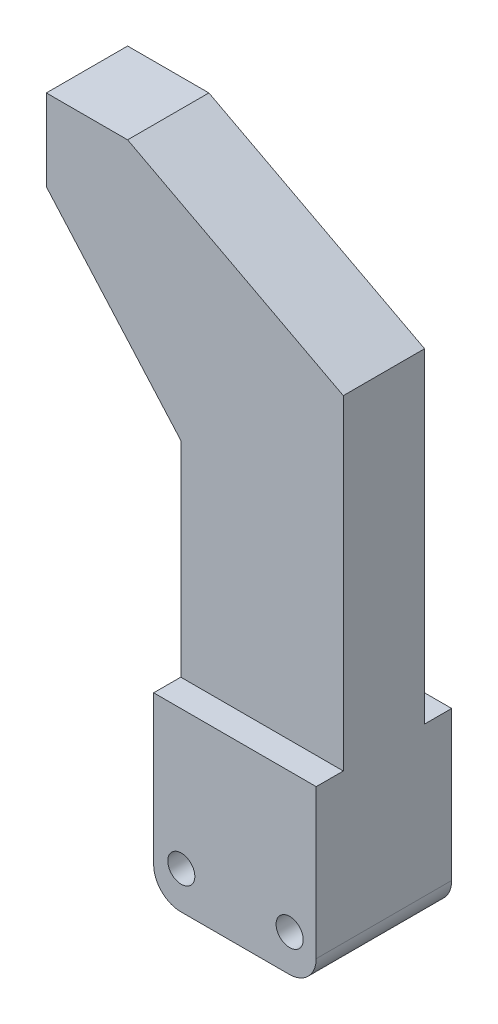
ISO-10303-21;
HEADER;
FILE_DESCRIPTION(('STEP AP214'),'2;1');
FILE_NAME('part.step','',(''),(''),'','','');
FILE_SCHEMA(('AUTOMOTIVE_DESIGN { 1 0 10303 214 1 1 1 1 }'));
ENDSEC;
DATA;
#1=APPLICATION_CONTEXT('core data for automotive mechanical design processes');
#2=APPLICATION_PROTOCOL_DEFINITION('international standard','automotive_design',2000,#1);
#3=PRODUCT_CONTEXT('',#1,'mechanical');
#4=PRODUCT('Part','Part','',(#3));
#5=PRODUCT_RELATED_PRODUCT_CATEGORY('part','',(#4));
#6=PRODUCT_DEFINITION_FORMATION('','',#4);
#7=PRODUCT_DEFINITION_CONTEXT('part definition',#1,'design');
#8=PRODUCT_DEFINITION('design','',#6,#7);
#9=PRODUCT_DEFINITION_SHAPE('','',#8);
#10=(LENGTH_UNIT() NAMED_UNIT(*) SI_UNIT(.MILLI.,.METRE.));
#11=(NAMED_UNIT(*) PLANE_ANGLE_UNIT() SI_UNIT($,.RADIAN.));
#12=(NAMED_UNIT(*) SI_UNIT($,.STERADIAN.) SOLID_ANGLE_UNIT());
#13=UNCERTAINTY_MEASURE_WITH_UNIT(LENGTH_MEASURE(1.E-05),#10,'distance_accuracy_value','');
#14=(GEOMETRIC_REPRESENTATION_CONTEXT(3) GLOBAL_UNCERTAINTY_ASSIGNED_CONTEXT((#13)) GLOBAL_UNIT_ASSIGNED_CONTEXT((#10,
#11,#12)) REPRESENTATION_CONTEXT('',''));
#15=CARTESIAN_POINT('',(0.,0.,0.));
#16=DIRECTION('',(0.,0.,1.));
#17=DIRECTION('',(1.,0.,0.));
#18=AXIS2_PLACEMENT_3D('',#15,#16,#17);
#19=CARTESIAN_POINT('',(0.,0.,9.));
#20=DIRECTION('',(-1.,0.,0.));
#21=DIRECTION('',(0.,-1.,0.));
#22=AXIS2_PLACEMENT_3D('',#19,#20,#21);
#23=PLANE('',#22);
#24=DIRECTION('',(0.,1.,0.));
#25=VECTOR('',#24,1.);
#26=CARTESIAN_POINT('',(0.,0.,15.));
#27=LINE('',#26,#25);
#28=CARTESIAN_POINT('',(0.,-33.,15.));
#29=VERTEX_POINT('',#28);
#30=CARTESIAN_POINT('',(0.,0.,15.));
#31=VERTEX_POINT('',#30);
#32=EDGE_CURVE('E133',#29,#31,#27,.T.);
#33=ORIENTED_EDGE('',*,*,#32,.F.);
#34=DIRECTION('',(0.,0.,-1.));
#35=VECTOR('',#34,1.);
#36=CARTESIAN_POINT('',(0.,-33.,9.));
#37=LINE('',#36,#35);
#38=CARTESIAN_POINT('',(0.,-33.,-15.));
#39=VERTEX_POINT('',#38);
#40=EDGE_CURVE('E11',#29,#39,#37,.T.);
#41=ORIENTED_EDGE('',*,*,#40,.T.);
#42=DIRECTION('',(0.,1.,0.));
#43=VECTOR('',#42,1.);
#44=CARTESIAN_POINT('',(0.,0.,-15.));
#45=LINE('',#44,#43);
#46=CARTESIAN_POINT('',(0.,0.,-15.));
#47=VERTEX_POINT('',#46);
#48=EDGE_CURVE('E166',#39,#47,#45,.T.);
#49=ORIENTED_EDGE('',*,*,#48,.T.);
#50=DIRECTION('',(0.,0.,-1.));
#51=VECTOR('',#50,1.);
#52=CARTESIAN_POINT('',(0.,0.,15.));
#53=LINE('',#52,#51);
#54=CARTESIAN_POINT('',(0.,0.,-9.));
#55=VERTEX_POINT('',#54);
#56=EDGE_CURVE('E150',#55,#47,#53,.T.);
#57=ORIENTED_EDGE('',*,*,#56,.F.);
#58=DIRECTION('',(0.,1.,0.));
#59=VECTOR('',#58,1.);
#60=CARTESIAN_POINT('',(0.,0.,-9.));
#61=LINE('',#60,#59);
#62=CARTESIAN_POINT('',(0.,72.,-9.));
#63=VERTEX_POINT('',#62);
#64=EDGE_CURVE('E189',#55,#63,#61,.T.);
#65=ORIENTED_EDGE('',*,*,#64,.T.);
#66=DIRECTION('',(0.,0.,-1.));
#67=VECTOR('',#66,1.);
#68=CARTESIAN_POINT('',(0.,72.,9.));
#69=LINE('',#68,#67);
#70=CARTESIAN_POINT('',(0.,72.,9.));
#71=VERTEX_POINT('',#70);
#72=EDGE_CURVE('E212',#71,#63,#69,.T.);
#73=ORIENTED_EDGE('',*,*,#72,.F.);
#74=DIRECTION('',(0.,1.,0.));
#75=VECTOR('',#74,1.);
#76=CARTESIAN_POINT('',(0.,0.,9.));
#77=LINE('',#76,#75);
#78=CARTESIAN_POINT('',(0.,0.,9.));
#79=VERTEX_POINT('',#78);
#80=EDGE_CURVE('E146',#79,#71,#77,.T.);
#81=ORIENTED_EDGE('',*,*,#80,.F.);
#82=EDGE_CURVE('E144',#31,#79,#53,.T.);
#83=ORIENTED_EDGE('',*,*,#82,.F.);
#84=EDGE_LOOP('',(#33,#41,#49,#57,#65,#73,#81,#83));
#85=FACE_BOUND('',#84,.T.);
#86=ADVANCED_FACE('F38',(#85),#23,.F.);
#87=CARTESIAN_POINT('',(0.,72.,9.));
#88=DIRECTION('',(-0.466293195068433,-0.884630237010284,0.));
#89=DIRECTION('',(0.884630237010285,-0.466293195068433,0.));
#90=AXIS2_PLACEMENT_3D('',#87,#88,#89);
#91=PLANE('',#90);
#92=DIRECTION('',(-0.884630237010284,0.466293195068433,0.));
#93=VECTOR('',#92,1.);
#94=CARTESIAN_POINT('',(0.,72.,-9.));
#95=LINE('',#94,#93);
#96=CARTESIAN_POINT('',(-47.7700327985554,97.1798325336954,-9.));
#97=VERTEX_POINT('',#96);
#98=EDGE_CURVE('E191',#63,#97,#95,.T.);
#99=ORIENTED_EDGE('',*,*,#98,.T.);
#100=DIRECTION('',(0.,0.,-1.));
#101=VECTOR('',#100,1.);
#102=CARTESIAN_POINT('',(-47.7700327985554,97.1798325336954,9.));
#103=LINE('',#102,#101);
#104=CARTESIAN_POINT('',(-47.7700327985554,97.1798325336954,9.));
#105=VERTEX_POINT('',#104);
#106=EDGE_CURVE('E209',#105,#97,#103,.T.);
#107=ORIENTED_EDGE('',*,*,#106,.F.);
#108=DIRECTION('',(-0.884630237010284,0.466293195068433,0.));
#109=VECTOR('',#108,1.);
#110=CARTESIAN_POINT('',(0.,72.,9.));
#111=LINE('',#110,#109);
#112=EDGE_CURVE('E176',#71,#105,#111,.T.);
#113=ORIENTED_EDGE('',*,*,#112,.F.);
#114=ORIENTED_EDGE('',*,*,#72,.T.);
#115=EDGE_LOOP('',(#99,#107,#113,#114));
#116=FACE_BOUND('',#115,.T.);
#117=ADVANCED_FACE('F254',(#116),#91,.F.);
#118=CARTESIAN_POINT('',(-47.7700327985554,97.1798325336954,9.));
#119=DIRECTION('',(0.,-1.,0.));
#120=DIRECTION('',(0.,0.,-1.));
#121=AXIS2_PLACEMENT_3D('',#118,#119,#120);
#122=PLANE('',#121);
#123=DIRECTION('',(-1.,0.,0.));
#124=VECTOR('',#123,1.);
#125=CARTESIAN_POINT('',(-47.7700327985554,97.1798325336954,-9.));
#126=LINE('',#125,#124);
#127=CARTESIAN_POINT('',(-65.7700327985554,97.1798325336954,-9.));
#128=VERTEX_POINT('',#127);
#129=EDGE_CURVE('E193',#97,#128,#126,.T.);
#130=ORIENTED_EDGE('',*,*,#129,.T.);
#131=DIRECTION('',(0.,0.,-1.));
#132=VECTOR('',#131,1.);
#133=CARTESIAN_POINT('',(-65.7700327985554,97.1798325336954,9.));
#134=LINE('',#133,#132);
#135=CARTESIAN_POINT('',(-65.7700327985554,97.1798325336954,9.));
#136=VERTEX_POINT('',#135);
#137=EDGE_CURVE('E206',#136,#128,#134,.T.);
#138=ORIENTED_EDGE('',*,*,#137,.F.);
#139=DIRECTION('',(-1.,0.,0.));
#140=VECTOR('',#139,1.);
#141=CARTESIAN_POINT('',(-47.7700327985554,97.1798325336954,9.));
#142=LINE('',#141,#140);
#143=EDGE_CURVE('E178',#105,#136,#142,.T.);
#144=ORIENTED_EDGE('',*,*,#143,.F.);
#145=ORIENTED_EDGE('',*,*,#106,.T.);
#146=EDGE_LOOP('',(#130,#138,#144,#145));
#147=FACE_BOUND('',#146,.T.);
#148=ADVANCED_FACE('F261',(#147),#122,.F.);
#149=CARTESIAN_POINT('',(-65.7700327985554,97.1798325336954,9.));
#150=DIRECTION('',(1.,0.,0.));
#151=DIRECTION('',(0.,0.,-1.));
#152=AXIS2_PLACEMENT_3D('',#149,#150,#151);
#153=PLANE('',#152);
#154=DIRECTION('',(0.,-1.,0.));
#155=VECTOR('',#154,1.);
#156=CARTESIAN_POINT('',(-65.7700327985554,97.1798325336954,-9.));
#157=LINE('',#156,#155);
#158=CARTESIAN_POINT('',(-65.7700327985554,79.1798325336954,-9.));
#159=VERTEX_POINT('',#158);
#160=EDGE_CURVE('E195',#128,#159,#157,.T.);
#161=ORIENTED_EDGE('',*,*,#160,.T.);
#162=DIRECTION('',(0.,0.,-1.));
#163=VECTOR('',#162,1.);
#164=CARTESIAN_POINT('',(-65.7700327985554,79.1798325336954,9.));
#165=LINE('',#164,#163);
#166=CARTESIAN_POINT('',(-65.7700327985554,79.1798325336954,9.));
#167=VERTEX_POINT('',#166);
#168=EDGE_CURVE('E203',#167,#159,#165,.T.);
#169=ORIENTED_EDGE('',*,*,#168,.F.);
#170=DIRECTION('',(0.,-1.,0.));
#171=VECTOR('',#170,1.);
#172=CARTESIAN_POINT('',(-65.7700327985554,97.1798325336954,9.));
#173=LINE('',#172,#171);
#174=EDGE_CURVE('E180',#136,#167,#173,.T.);
#175=ORIENTED_EDGE('',*,*,#174,.F.);
#176=ORIENTED_EDGE('',*,*,#137,.T.);
#177=EDGE_LOOP('',(#161,#169,#175,#176));
#178=FACE_BOUND('',#177,.T.);
#179=ADVANCED_FACE('F267',(#178),#153,.F.);
#180=CARTESIAN_POINT('',(-65.7700327985554,79.1798325336954,9.));
#181=DIRECTION('',(0.749895514424868,0.661556284412342,0.));
#182=DIRECTION('',(-0.661556284412342,0.749895514424868,0.));
#183=AXIS2_PLACEMENT_3D('',#180,#181,#182);
#184=PLANE('',#183);
#185=DIRECTION('',(0.661556284412342,-0.749895514424868,0.));
#186=VECTOR('',#185,1.);
#187=CARTESIAN_POINT('',(-65.7700327985554,79.1798325336954,-9.));
#188=LINE('',#187,#186);
#189=CARTESIAN_POINT('',(-36.,45.4345343845764,-9.));
#190=VERTEX_POINT('',#189);
#191=EDGE_CURVE('E197',#159,#190,#188,.T.);
#192=ORIENTED_EDGE('',*,*,#191,.T.);
#193=DIRECTION('',(0.,0.,-1.));
#194=VECTOR('',#193,1.);
#195=CARTESIAN_POINT('',(-36.,45.4345343845764,9.));
#196=LINE('',#195,#194);
#197=CARTESIAN_POINT('',(-36.,45.4345343845764,9.));
#198=VERTEX_POINT('',#197);
#199=EDGE_CURVE('E187',#198,#190,#196,.T.);
#200=ORIENTED_EDGE('',*,*,#199,.F.);
#201=DIRECTION('',(0.661556284412342,-0.749895514424868,0.));
#202=VECTOR('',#201,1.);
#203=CARTESIAN_POINT('',(-65.7700327985554,79.1798325336954,9.));
#204=LINE('',#203,#202);
#205=EDGE_CURVE('E182',#167,#198,#204,.T.);
#206=ORIENTED_EDGE('',*,*,#205,.F.);
#207=ORIENTED_EDGE('',*,*,#168,.T.);
#208=EDGE_LOOP('',(#192,#200,#206,#207));
#209=FACE_BOUND('',#208,.T.);
#210=ADVANCED_FACE('F271',(#209),#184,.F.);
#211=CARTESIAN_POINT('',(-36.,45.4345343845764,9.));
#212=DIRECTION('',(1.,0.,0.));
#213=DIRECTION('',(0.,1.,0.));
#214=AXIS2_PLACEMENT_3D('',#211,#212,#213);
#215=PLANE('',#214);
#216=DIRECTION('',(0.,-1.,0.));
#217=VECTOR('',#216,1.);
#218=CARTESIAN_POINT('',(-36.,0.,-15.));
#219=LINE('',#218,#217);
#220=CARTESIAN_POINT('',(-36.,0.,-15.));
#221=VERTEX_POINT('',#220);
#222=CARTESIAN_POINT('',(-36.,-33.,-15.));
#223=VERTEX_POINT('',#222);
#224=EDGE_CURVE('E160',#221,#223,#219,.T.);
#225=ORIENTED_EDGE('',*,*,#224,.T.);
#226=DIRECTION('',(0.,0.,-1.));
#227=VECTOR('',#226,1.);
#228=CARTESIAN_POINT('',(-36.,-33.,9.));
#229=LINE('',#228,#227);
#230=CARTESIAN_POINT('',(-36.,-33.,15.));
#231=VERTEX_POINT('',#230);
#232=EDGE_CURVE('E61',#223,#231,#229,.F.);
#233=ORIENTED_EDGE('',*,*,#232,.T.);
#234=DIRECTION('',(0.,-1.,0.));
#235=VECTOR('',#234,1.);
#236=CARTESIAN_POINT('',(-36.,0.,15.));
#237=LINE('',#236,#235);
#238=CARTESIAN_POINT('',(-36.,0.,15.));
#239=VERTEX_POINT('',#238);
#240=EDGE_CURVE('E170',#239,#231,#237,.T.);
#241=ORIENTED_EDGE('',*,*,#240,.F.);
#242=DIRECTION('',(0.,0.,-1.));
#243=VECTOR('',#242,1.);
#244=CARTESIAN_POINT('',(-36.,0.,15.));
#245=LINE('',#244,#243);
#246=CARTESIAN_POINT('',(-36.,0.,9.));
#247=VERTEX_POINT('',#246);
#248=EDGE_CURVE('E154',#239,#247,#245,.T.);
#249=ORIENTED_EDGE('',*,*,#248,.T.);
#250=DIRECTION('',(0.,-1.,0.));
#251=VECTOR('',#250,1.);
#252=CARTESIAN_POINT('',(-36.,45.4345343845764,9.));
#253=LINE('',#252,#251);
#254=EDGE_CURVE('E184',#198,#247,#253,.T.);
#255=ORIENTED_EDGE('',*,*,#254,.F.);
#256=ORIENTED_EDGE('',*,*,#199,.T.);
#257=DIRECTION('',(0.,-1.,0.));
#258=VECTOR('',#257,1.);
#259=CARTESIAN_POINT('',(-36.,45.4345343845764,-9.));
#260=LINE('',#259,#258);
#261=CARTESIAN_POINT('',(-36.,0.,-9.));
#262=VERTEX_POINT('',#261);
#263=EDGE_CURVE('E174',#190,#262,#260,.T.);
#264=ORIENTED_EDGE('',*,*,#263,.T.);
#265=EDGE_CURVE('E155',#262,#221,#245,.T.);
#266=ORIENTED_EDGE('',*,*,#265,.T.);
#267=EDGE_LOOP('',(#225,#233,#241,#249,#255,#256,#264,#266));
#268=FACE_BOUND('',#267,.T.);
#269=ADVANCED_FACE('F238',(#268),#215,.F.);
#270=CARTESIAN_POINT('',(0.,0.,9.));
#271=DIRECTION('',(0.,0.,1.));
#272=DIRECTION('',(1.,0.,0.));
#273=AXIS2_PLACEMENT_3D('',#270,#271,#272);
#274=PLANE('',#273);
#275=DIRECTION('',(1.,0.,0.));
#276=VECTOR('',#275,1.);
#277=CARTESIAN_POINT('',(-36.,0.,9.));
#278=LINE('',#277,#276);
#279=EDGE_CURVE('E172',#247,#79,#278,.T.);
#280=ORIENTED_EDGE('',*,*,#279,.T.);
#281=ORIENTED_EDGE('',*,*,#80,.T.);
#282=ORIENTED_EDGE('',*,*,#112,.T.);
#283=ORIENTED_EDGE('',*,*,#143,.T.);
#284=ORIENTED_EDGE('',*,*,#174,.T.);
#285=ORIENTED_EDGE('',*,*,#205,.T.);
#286=ORIENTED_EDGE('',*,*,#254,.T.);
#287=EDGE_LOOP('',(#280,#281,#282,#283,#284,#285,#286));
#288=FACE_BOUND('',#287,.T.);
#289=ADVANCED_FACE('F277',(#288),#274,.T.);
#290=CARTESIAN_POINT('',(0.,0.,-9.));
#291=DIRECTION('',(0.,0.,1.));
#292=DIRECTION('',(1.,0.,0.));
#293=AXIS2_PLACEMENT_3D('',#290,#291,#292);
#294=PLANE('',#293);
#295=DIRECTION('',(1.,0.,0.));
#296=VECTOR('',#295,1.);
#297=CARTESIAN_POINT('',(-36.,0.,-9.));
#298=LINE('',#297,#296);
#299=EDGE_CURVE('E149',#262,#55,#298,.T.);
#300=ORIENTED_EDGE('',*,*,#299,.F.);
#301=ORIENTED_EDGE('',*,*,#263,.F.);
#302=ORIENTED_EDGE('',*,*,#191,.F.);
#303=ORIENTED_EDGE('',*,*,#160,.F.);
#304=ORIENTED_EDGE('',*,*,#129,.F.);
#305=ORIENTED_EDGE('',*,*,#98,.F.);
#306=ORIENTED_EDGE('',*,*,#64,.F.);
#307=EDGE_LOOP('',(#300,#301,#302,#303,#304,#305,#306));
#308=FACE_BOUND('',#307,.T.);
#309=ADVANCED_FACE('F278',(#308),#294,.F.);
#310=CARTESIAN_POINT('',(-36.,0.,15.));
#311=DIRECTION('',(0.,-1.,0.));
#312=DIRECTION('',(0.,0.,-1.));
#313=AXIS2_PLACEMENT_3D('',#310,#311,#312);
#314=PLANE('',#313);
#315=ORIENTED_EDGE('',*,*,#265,.F.);
#316=ORIENTED_EDGE('',*,*,#299,.T.);
#317=ORIENTED_EDGE('',*,*,#56,.T.);
#318=DIRECTION('',(-1.,0.,0.));
#319=VECTOR('',#318,1.);
#320=CARTESIAN_POINT('',(-36.,0.,-15.));
#321=LINE('',#320,#319);
#322=EDGE_CURVE('E168',#47,#221,#321,.T.);
#323=ORIENTED_EDGE('',*,*,#322,.T.);
#324=EDGE_LOOP('',(#315,#316,#317,#323));
#325=FACE_BOUND('',#324,.T.);
#326=ADVANCED_FACE('F243',(#325),#314,.F.);
#327=ORIENTED_EDGE('',*,*,#279,.F.);
#328=ORIENTED_EDGE('',*,*,#248,.F.);
#329=DIRECTION('',(-1.,0.,0.));
#330=VECTOR('',#329,1.);
#331=CARTESIAN_POINT('',(-36.,0.,15.));
#332=LINE('',#331,#330);
#333=EDGE_CURVE('E137',#31,#239,#332,.T.);
#334=ORIENTED_EDGE('',*,*,#333,.F.);
#335=ORIENTED_EDGE('',*,*,#82,.T.);
#336=EDGE_LOOP('',(#327,#328,#334,#335));
#337=FACE_BOUND('',#336,.T.);
#338=ADVANCED_FACE('F152',(#337),#314,.F.);
#339=CARTESIAN_POINT('',(-36.,-39.,15.));
#340=DIRECTION('',(0.,1.,0.));
#341=DIRECTION('',(0.,0.,1.));
#342=AXIS2_PLACEMENT_3D('',#339,#340,#341);
#343=PLANE('',#342);
#344=DIRECTION('',(1.,0.,0.));
#345=VECTOR('',#344,1.);
#346=CARTESIAN_POINT('',(-36.,-39.,15.));
#347=LINE('',#346,#345);
#348=CARTESIAN_POINT('',(-30.,-39.,15.));
#349=VERTEX_POINT('',#348);
#350=CARTESIAN_POINT('',(-5.99999999999999,-39.,15.));
#351=VERTEX_POINT('',#350);
#352=EDGE_CURVE('E141',#349,#351,#347,.T.);
#353=ORIENTED_EDGE('',*,*,#352,.F.);
#354=DIRECTION('',(0.,0.,-1.));
#355=VECTOR('',#354,1.);
#356=CARTESIAN_POINT('',(-30.,-39.,15.));
#357=LINE('',#356,#355);
#358=CARTESIAN_POINT('',(-30.,-39.,-15.));
#359=VERTEX_POINT('',#358);
#360=EDGE_CURVE('E217',#349,#359,#357,.T.);
#361=ORIENTED_EDGE('',*,*,#360,.T.);
#362=DIRECTION('',(1.,0.,0.));
#363=VECTOR('',#362,1.);
#364=CARTESIAN_POINT('',(-36.,-39.,-15.));
#365=LINE('',#364,#363);
#366=CARTESIAN_POINT('',(-5.99999999999999,-39.,-15.));
#367=VERTEX_POINT('',#366);
#368=EDGE_CURVE('E162',#359,#367,#365,.T.);
#369=ORIENTED_EDGE('',*,*,#368,.T.);
#370=DIRECTION('',(0.,0.,-1.));
#371=VECTOR('',#370,1.);
#372=CARTESIAN_POINT('',(-5.99999999999999,-39.,15.));
#373=LINE('',#372,#371);
#374=EDGE_CURVE('E215',#367,#351,#373,.F.);
#375=ORIENTED_EDGE('',*,*,#374,.T.);
#376=EDGE_LOOP('',(#353,#361,#369,#375));
#377=FACE_BOUND('',#376,.T.);
#378=ADVANCED_FACE('F230',(#377),#343,.F.);
#379=CARTESIAN_POINT('',(0.,0.,15.));
#380=DIRECTION('',(0.,0.,1.));
#381=DIRECTION('',(1.,0.,0.));
#382=AXIS2_PLACEMENT_3D('',#379,#380,#381);
#383=PLANE('',#382);
#384=CARTESIAN_POINT('',(-5.88176624956482,-30.8240304016349,15.));
#385=DIRECTION('',(0.,0.,1.));
#386=DIRECTION('',(1.,0.,0.));
#387=AXIS2_PLACEMENT_3D('',#384,#385,#386);
#388=CIRCLE('',#387,3.);
#389=CARTESIAN_POINT('',(-2.88176624956482,-30.8240304016349,15.));
#390=VERTEX_POINT('',#389);
#391=EDGE_CURVE('E307',#390,#390,#388,.T.);
#392=ORIENTED_EDGE('',*,*,#391,.F.);
#393=EDGE_LOOP('',(#392));
#394=FACE_BOUND('',#393,.T.);
#395=CARTESIAN_POINT('',(-29.8812960574945,-30.6738005833785,15.));
#396=DIRECTION('',(0.,0.,1.));
#397=DIRECTION('',(1.,0.,0.));
#398=AXIS2_PLACEMENT_3D('',#395,#396,#397);
#399=CIRCLE('',#398,3.);
#400=CARTESIAN_POINT('',(-26.8812960574945,-30.6738005833785,15.));
#401=VERTEX_POINT('',#400);
#402=EDGE_CURVE('E308',#401,#401,#399,.T.);
#403=ORIENTED_EDGE('',*,*,#402,.F.);
#404=EDGE_LOOP('',(#403));
#405=FACE_BOUND('',#404,.T.);
#406=ORIENTED_EDGE('',*,*,#240,.T.);
#407=CARTESIAN_POINT('',(-30.,-33.,15.));
#408=DIRECTION('',(0.,0.,1.));
#409=DIRECTION('',(1.,0.,0.));
#410=AXIS2_PLACEMENT_3D('',#407,#408,#409);
#411=CIRCLE('',#410,6.);
#412=EDGE_CURVE('E46',#231,#349,#411,.T.);
#413=ORIENTED_EDGE('',*,*,#412,.T.);
#414=ORIENTED_EDGE('',*,*,#352,.T.);
#415=CARTESIAN_POINT('',(-6.,-33.,15.));
#416=DIRECTION('',(0.,0.,1.));
#417=DIRECTION('',(1.,0.,0.));
#418=AXIS2_PLACEMENT_3D('',#415,#416,#417);
#419=CIRCLE('',#418,6.);
#420=EDGE_CURVE('E53',#351,#29,#419,.T.);
#421=ORIENTED_EDGE('',*,*,#420,.T.);
#422=ORIENTED_EDGE('',*,*,#32,.T.);
#423=ORIENTED_EDGE('',*,*,#333,.T.);
#424=EDGE_LOOP('',(#406,#413,#414,#421,#422,#423));
#425=FACE_BOUND('',#424,.T.);
#426=ADVANCED_FACE('F135',(#394,#405,#425),#383,.T.);
#427=CARTESIAN_POINT('',(0.,0.,-15.));
#428=DIRECTION('',(0.,0.,1.));
#429=DIRECTION('',(1.,0.,0.));
#430=AXIS2_PLACEMENT_3D('',#427,#428,#429);
#431=PLANE('',#430);
#432=CARTESIAN_POINT('',(-5.88176624956482,-30.8240304016349,-15.));
#433=DIRECTION('',(0.,0.,1.));
#434=DIRECTION('',(1.,0.,0.));
#435=AXIS2_PLACEMENT_3D('',#432,#433,#434);
#436=CIRCLE('',#435,3.);
#437=CARTESIAN_POINT('',(-2.88176624956482,-30.8240304016349,-15.));
#438=VERTEX_POINT('',#437);
#439=EDGE_CURVE('E163',#438,#438,#436,.T.);
#440=ORIENTED_EDGE('',*,*,#439,.T.);
#441=EDGE_LOOP('',(#440));
#442=FACE_BOUND('',#441,.T.);
#443=CARTESIAN_POINT('',(-29.8812960574945,-30.6738005833785,-15.));
#444=DIRECTION('',(0.,0.,1.));
#445=DIRECTION('',(1.,0.,0.));
#446=AXIS2_PLACEMENT_3D('',#443,#444,#445);
#447=CIRCLE('',#446,3.);
#448=CARTESIAN_POINT('',(-26.8812960574945,-30.6738005833785,-15.));
#449=VERTEX_POINT('',#448);
#450=EDGE_CURVE('E312',#449,#449,#447,.T.);
#451=ORIENTED_EDGE('',*,*,#450,.T.);
#452=EDGE_LOOP('',(#451));
#453=FACE_BOUND('',#452,.T.);
#454=ORIENTED_EDGE('',*,*,#368,.F.);
#455=CARTESIAN_POINT('',(-30.,-33.,-15.));
#456=DIRECTION('',(0.,0.,1.));
#457=DIRECTION('',(1.,0.,0.));
#458=AXIS2_PLACEMENT_3D('',#455,#456,#457);
#459=CIRCLE('',#458,6.);
#460=EDGE_CURVE('E222',#359,#223,#459,.F.);
#461=ORIENTED_EDGE('',*,*,#460,.T.);
#462=ORIENTED_EDGE('',*,*,#224,.F.);
#463=ORIENTED_EDGE('',*,*,#322,.F.);
#464=ORIENTED_EDGE('',*,*,#48,.F.);
#465=CARTESIAN_POINT('',(-6.,-33.,-15.));
#466=DIRECTION('',(0.,0.,1.));
#467=DIRECTION('',(1.,0.,0.));
#468=AXIS2_PLACEMENT_3D('',#465,#466,#467);
#469=CIRCLE('',#468,6.);
#470=EDGE_CURVE('E220',#39,#367,#469,.F.);
#471=ORIENTED_EDGE('',*,*,#470,.T.);
#472=EDGE_LOOP('',(#454,#461,#462,#463,#464,#471));
#473=FACE_BOUND('',#472,.T.);
#474=ADVANCED_FACE('F236',(#442,#453,#473),#431,.F.);
#475=CARTESIAN_POINT('',(-29.8812960574945,-30.6738005833785,-15.));
#476=DIRECTION('',(0.,0.,1.));
#477=DIRECTION('',(1.,0.,0.));
#478=AXIS2_PLACEMENT_3D('',#475,#476,#477);
#479=CYLINDRICAL_SURFACE('',#478,3.);
#480=ORIENTED_EDGE('',*,*,#450,.F.);
#481=EDGE_LOOP('',(#480));
#482=FACE_BOUND('',#481,.T.);
#483=ORIENTED_EDGE('',*,*,#402,.T.);
#484=EDGE_LOOP('',(#483));
#485=FACE_BOUND('',#484,.T.);
#486=ADVANCED_FACE('F291',(#482,#485),#479,.F.);
#487=CARTESIAN_POINT('',(-5.88176624956482,-30.8240304016349,-15.));
#488=DIRECTION('',(0.,0.,1.));
#489=DIRECTION('',(1.,0.,0.));
#490=AXIS2_PLACEMENT_3D('',#487,#488,#489);
#491=CYLINDRICAL_SURFACE('',#490,3.);
#492=ORIENTED_EDGE('',*,*,#439,.F.);
#493=EDGE_LOOP('',(#492));
#494=FACE_BOUND('',#493,.T.);
#495=ORIENTED_EDGE('',*,*,#391,.T.);
#496=EDGE_LOOP('',(#495));
#497=FACE_BOUND('',#496,.T.);
#498=ADVANCED_FACE('F252',(#494,#497),#491,.F.);
#499=CARTESIAN_POINT('',(-30.,-33.,15.));
#500=DIRECTION('',(0.,0.,-1.));
#501=DIRECTION('',(-1.,0.,0.));
#502=AXIS2_PLACEMENT_3D('',#499,#500,#501);
#503=CYLINDRICAL_SURFACE('',#502,6.);
#504=ORIENTED_EDGE('',*,*,#412,.F.);
#505=ORIENTED_EDGE('',*,*,#232,.F.);
#506=ORIENTED_EDGE('',*,*,#460,.F.);
#507=ORIENTED_EDGE('',*,*,#360,.F.);
#508=EDGE_LOOP('',(#504,#505,#506,#507));
#509=FACE_BOUND('',#508,.T.);
#510=ADVANCED_FACE('F233',(#509),#503,.T.);
#511=CARTESIAN_POINT('',(-6.,-33.,9.));
#512=DIRECTION('',(0.,0.,-1.));
#513=DIRECTION('',(-1.,0.,0.));
#514=AXIS2_PLACEMENT_3D('',#511,#512,#513);
#515=CYLINDRICAL_SURFACE('',#514,6.);
#516=ORIENTED_EDGE('',*,*,#420,.F.);
#517=ORIENTED_EDGE('',*,*,#374,.F.);
#518=ORIENTED_EDGE('',*,*,#470,.F.);
#519=ORIENTED_EDGE('',*,*,#40,.F.);
#520=EDGE_LOOP('',(#516,#517,#518,#519));
#521=FACE_BOUND('',#520,.T.);
#522=ADVANCED_FACE('F40',(#521),#515,.T.);
#523=CLOSED_SHELL('',(#86,#117,#148,#179,#210,#269,#289,#309,#326,#338,#378,#426,#474,#486,#498,
#510,#522));
#524=MANIFOLD_SOLID_BREP('B2',#523);
#525=ADVANCED_BREP_SHAPE_REPRESENTATION('',(#18,#524),#14);
#526=SHAPE_DEFINITION_REPRESENTATION(#9,#525);
ENDSEC;
END-ISO-10303-21;
